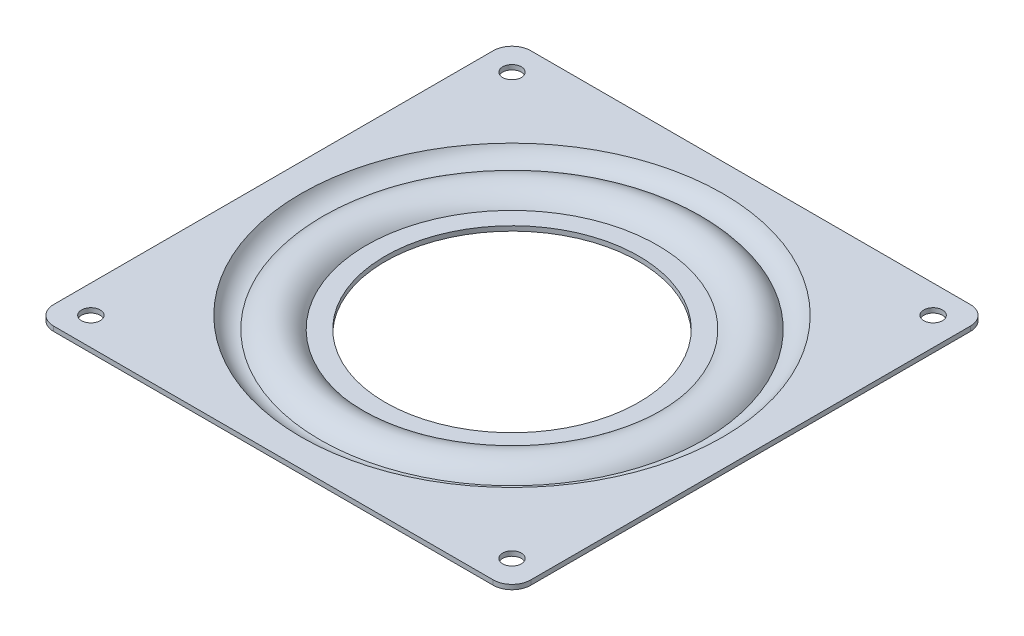
ISO-10303-21;
HEADER;
FILE_DESCRIPTION(('STEP AP214'),'2;1');
FILE_NAME('part.step','',(''),(''),'','','');
FILE_SCHEMA(('AUTOMOTIVE_DESIGN { 1 0 10303 214 1 1 1 1 }'));
ENDSEC;
DATA;
#1=APPLICATION_CONTEXT('core data for automotive mechanical design processes');
#2=APPLICATION_PROTOCOL_DEFINITION('international standard','automotive_design',2000,#1);
#3=PRODUCT_CONTEXT('',#1,'mechanical');
#4=PRODUCT('Part','Part','',(#3));
#5=PRODUCT_RELATED_PRODUCT_CATEGORY('part','',(#4));
#6=PRODUCT_DEFINITION_FORMATION('','',#4);
#7=PRODUCT_DEFINITION_CONTEXT('part definition',#1,'design');
#8=PRODUCT_DEFINITION('design','',#6,#7);
#9=PRODUCT_DEFINITION_SHAPE('','',#8);
#10=(LENGTH_UNIT() NAMED_UNIT(*) SI_UNIT(.MILLI.,.METRE.));
#11=(NAMED_UNIT(*) PLANE_ANGLE_UNIT() SI_UNIT($,.RADIAN.));
#12=(NAMED_UNIT(*) SI_UNIT($,.STERADIAN.) SOLID_ANGLE_UNIT());
#13=UNCERTAINTY_MEASURE_WITH_UNIT(LENGTH_MEASURE(1.E-05),#10,'distance_accuracy_value','');
#14=(GEOMETRIC_REPRESENTATION_CONTEXT(3) GLOBAL_UNCERTAINTY_ASSIGNED_CONTEXT((#13)) GLOBAL_UNIT_ASSIGNED_CONTEXT((#10,
#11,#12)) REPRESENTATION_CONTEXT('',''));
#15=CARTESIAN_POINT('',(0.,0.,0.));
#16=DIRECTION('',(0.,0.,1.));
#17=DIRECTION('',(1.,0.,0.));
#18=AXIS2_PLACEMENT_3D('',#15,#16,#17);
#19=CARTESIAN_POINT('',(0.,1.93021402871017,0.));
#20=DIRECTION('',(0.,1.,0.));
#21=DIRECTION('',(0.,0.,1.));
#22=AXIS2_PLACEMENT_3D('',#19,#20,#21);
#23=TOROIDAL_SURFACE('',#22,40.8455333460894,5.5);
#24=CARTESIAN_POINT('',(0.,-3.5402036630778,0.));
#25=DIRECTION('',(0.,1.,0.));
#26=DIRECTION('',(0.,0.,1.));
#27=AXIS2_PLACEMENT_3D('',#24,#25,#26);
#28=CIRCLE('',#27,40.2758577565007);
#29=CARTESIAN_POINT('',(0.,-3.5402036630778,40.2758577565007));
#30=VERTEX_POINT('',#29);
#31=EDGE_CURVE('E11',#30,#30,#28,.T.);
#32=ORIENTED_EDGE('',*,*,#31,.T.);
#33=EDGE_LOOP('',(#32));
#34=FACE_BOUND('',#33,.T.);
#35=CARTESIAN_POINT('',(0.,-1.,0.));
#36=DIRECTION('',(0.,1.,0.));
#37=DIRECTION('',(0.,0.,1.));
#38=AXIS2_PLACEMENT_3D('',#35,#36,#37);
#39=CIRCLE('',#38,45.4999770019897);
#40=CARTESIAN_POINT('',(0.,-1.,45.4999770019897));
#41=VERTEX_POINT('',#40);
#42=EDGE_CURVE('E46',#41,#41,#39,.F.);
#43=ORIENTED_EDGE('',*,*,#42,.T.);
#44=EDGE_LOOP('',(#43));
#45=FACE_BOUND('',#44,.T.);
#46=ADVANCED_FACE('F43',(#34,#45),#23,.T.);
#47=CARTESIAN_POINT('',(0.,-6.,0.));
#48=DIRECTION('',(0.,1.,0.));
#49=DIRECTION('',(0.,0.,1.));
#50=AXIS2_PLACEMENT_3D('',#47,#48,#49);
#51=TOROIDAL_SURFACE('',#50,35.9227666730447,5.);
#52=CARTESIAN_POINT('',(0.,-3.56978597128984,0.));
#53=DIRECTION('',(0.,1.,0.));
#54=DIRECTION('',(0.,0.,1.));
#55=AXIS2_PLACEMENT_3D('',#52,#53,#54);
#56=CIRCLE('',#55,31.5530916537029);
#57=CARTESIAN_POINT('',(0.,-3.56978597128984,31.5530916537029));
#58=VERTEX_POINT('',#57);
#59=EDGE_CURVE('E52',#58,#58,#56,.T.);
#60=ORIENTED_EDGE('',*,*,#59,.T.);
#61=EDGE_LOOP('',(#60));
#62=FACE_BOUND('',#61,.T.);
#63=ORIENTED_EDGE('',*,*,#31,.F.);
#64=EDGE_LOOP('',(#63));
#65=FACE_BOUND('',#64,.T.);
#66=ADVANCED_FACE('F204',(#62,#65),#51,.F.);
#67=CARTESIAN_POINT('',(0.,-3.56978597128984,0.));
#68=DIRECTION('',(0.,-1.,0.));
#69=DIRECTION('',(0.,0.,-1.));
#70=AXIS2_PLACEMENT_3D('',#67,#68,#69);
#71=PLANE('',#70);
#72=CARTESIAN_POINT('',(0.,-3.56978597128984,0.));
#73=DIRECTION('',(0.,1.,0.));
#74=DIRECTION('',(0.,0.,1.));
#75=AXIS2_PLACEMENT_3D('',#72,#73,#74);
#76=CIRCLE('',#75,27.);
#77=CARTESIAN_POINT('',(0.,-3.56978597128984,27.));
#78=VERTEX_POINT('',#77);
#79=EDGE_CURVE('E198',#78,#78,#76,.T.);
#80=ORIENTED_EDGE('',*,*,#79,.T.);
#81=EDGE_LOOP('',(#80));
#82=FACE_BOUND('',#81,.T.);
#83=ORIENTED_EDGE('',*,*,#59,.F.);
#84=EDGE_LOOP('',(#83));
#85=FACE_BOUND('',#84,.T.);
#86=ADVANCED_FACE('F207',(#82,#85),#71,.T.);
#87=CARTESIAN_POINT('',(0.,6.91716042477171,0.));
#88=DIRECTION('',(0.,1.,0.));
#89=DIRECTION('',(0.,0.,1.));
#90=AXIS2_PLACEMENT_3D('',#87,#88,#89);
#91=CYLINDRICAL_SURFACE('',#90,27.);
#92=ORIENTED_EDGE('',*,*,#79,.F.);
#93=EDGE_LOOP('',(#92));
#94=FACE_BOUND('',#93,.T.);
#95=CARTESIAN_POINT('',(0.,-2.56978597128984,0.));
#96=DIRECTION('',(0.,1.,0.));
#97=DIRECTION('',(0.,0.,1.));
#98=AXIS2_PLACEMENT_3D('',#95,#96,#97);
#99=CIRCLE('',#98,27.);
#100=CARTESIAN_POINT('',(0.,-2.56978597128984,27.));
#101=VERTEX_POINT('',#100);
#102=EDGE_CURVE('E195',#101,#101,#99,.T.);
#103=ORIENTED_EDGE('',*,*,#102,.T.);
#104=EDGE_LOOP('',(#103));
#105=FACE_BOUND('',#104,.T.);
#106=ADVANCED_FACE('F209',(#94,#105),#91,.F.);
#107=CARTESIAN_POINT('',(0.,-2.56978597128984,0.));
#108=DIRECTION('',(0.,-1.,0.));
#109=DIRECTION('',(0.,0.,-1.));
#110=AXIS2_PLACEMENT_3D('',#107,#108,#109);
#111=PLANE('',#110);
#112=ORIENTED_EDGE('',*,*,#102,.F.);
#113=EDGE_LOOP('',(#112));
#114=FACE_BOUND('',#113,.T.);
#115=CARTESIAN_POINT('',(0.,-2.56978597128984,0.));
#116=DIRECTION('',(0.,1.,0.));
#117=DIRECTION('',(0.,0.,1.));
#118=AXIS2_PLACEMENT_3D('',#115,#116,#117);
#119=CIRCLE('',#118,31.);
#120=CARTESIAN_POINT('',(0.,-2.56978597128984,31.));
#121=VERTEX_POINT('',#120);
#122=EDGE_CURVE('E192',#121,#121,#119,.T.);
#123=ORIENTED_EDGE('',*,*,#122,.T.);
#124=EDGE_LOOP('',(#123));
#125=FACE_BOUND('',#124,.T.);
#126=ADVANCED_FACE('F216',(#114,#125),#111,.F.);
#127=CARTESIAN_POINT('',(0.,-6.,0.));
#128=DIRECTION('',(0.,1.,0.));
#129=DIRECTION('',(0.,0.,1.));
#130=AXIS2_PLACEMENT_3D('',#127,#128,#129);
#131=TOROIDAL_SURFACE('',#130,35.9227666730447,6.);
#132=ORIENTED_EDGE('',*,*,#122,.F.);
#133=EDGE_LOOP('',(#132));
#134=FACE_BOUND('',#133,.T.);
#135=CARTESIAN_POINT('',(0.,-2.56978597128983,0.));
#136=DIRECTION('',(0.,1.,0.));
#137=DIRECTION('',(0.,0.,1.));
#138=AXIS2_PLACEMENT_3D('',#135,#136,#137);
#139=CIRCLE('',#138,40.8455333460895);
#140=CARTESIAN_POINT('',(0.,-2.56978597128983,40.8455333460895));
#141=VERTEX_POINT('',#140);
#142=EDGE_CURVE('E189',#141,#141,#139,.T.);
#143=ORIENTED_EDGE('',*,*,#142,.T.);
#144=EDGE_LOOP('',(#143));
#145=FACE_BOUND('',#144,.T.);
#146=ADVANCED_FACE('F311',(#134,#145),#131,.T.);
#147=CARTESIAN_POINT('',(0.,1.93021402871017,0.));
#148=DIRECTION('',(0.,1.,0.));
#149=DIRECTION('',(0.,0.,1.));
#150=AXIS2_PLACEMENT_3D('',#147,#148,#149);
#151=TOROIDAL_SURFACE('',#150,40.8455333460894,4.5);
#152=ORIENTED_EDGE('',*,*,#142,.F.);
#153=EDGE_LOOP('',(#152));
#154=FACE_BOUND('',#153,.T.);
#155=CARTESIAN_POINT('',(0.,0.,0.));
#156=DIRECTION('',(0.,1.,0.));
#157=DIRECTION('',(0.,0.,1.));
#158=AXIS2_PLACEMENT_3D('',#155,#156,#157);
#159=CIRCLE('',#158,44.9105393489596);
#160=CARTESIAN_POINT('',(0.,0.,44.9105393489596));
#161=VERTEX_POINT('',#160);
#162=EDGE_CURVE('E142',#161,#161,#159,.T.);
#163=ORIENTED_EDGE('',*,*,#162,.T.);
#164=EDGE_LOOP('',(#163));
#165=FACE_BOUND('',#164,.T.);
#166=ADVANCED_FACE('F279',(#154,#165),#151,.F.);
#167=CARTESIAN_POINT('',(-50.8,-1.,0.));
#168=DIRECTION('',(-1.,0.,0.));
#169=DIRECTION('',(0.,0.,1.));
#170=AXIS2_PLACEMENT_3D('',#167,#168,#169);
#171=PLANE('',#170);
#172=DIRECTION('',(0.,0.,1.));
#173=VECTOR('',#172,1.);
#174=CARTESIAN_POINT('',(-50.8,0.,0.));
#175=LINE('',#174,#173);
#176=CARTESIAN_POINT('',(-50.8,0.,-46.8000000000002));
#177=VERTEX_POINT('',#176);
#178=CARTESIAN_POINT('',(-50.8,0.,46.7999999999998));
#179=VERTEX_POINT('',#178);
#180=EDGE_CURVE('E157',#177,#179,#175,.T.);
#181=ORIENTED_EDGE('',*,*,#180,.F.);
#182=DIRECTION('',(0.,1.,0.));
#183=VECTOR('',#182,1.);
#184=CARTESIAN_POINT('',(-50.8,-1.,-46.8000000000002));
#185=LINE('',#184,#183);
#186=CARTESIAN_POINT('',(-50.8,-1.,-46.8000000000002));
#187=VERTEX_POINT('',#186);
#188=EDGE_CURVE('E60',#187,#177,#185,.T.);
#189=ORIENTED_EDGE('',*,*,#188,.F.);
#190=DIRECTION('',(0.,0.,1.));
#191=VECTOR('',#190,1.);
#192=CARTESIAN_POINT('',(-50.8,-1.,0.));
#193=LINE('',#192,#191);
#194=CARTESIAN_POINT('',(-50.8,-1.,46.7999999999998));
#195=VERTEX_POINT('',#194);
#196=EDGE_CURVE('E250',#187,#195,#193,.T.);
#197=ORIENTED_EDGE('',*,*,#196,.T.);
#198=DIRECTION('',(0.,1.,0.));
#199=VECTOR('',#198,1.);
#200=CARTESIAN_POINT('',(-50.8,-1.,46.7999999999998));
#201=LINE('',#200,#199);
#202=EDGE_CURVE('E101',#195,#179,#201,.T.);
#203=ORIENTED_EDGE('',*,*,#202,.T.);
#204=EDGE_LOOP('',(#181,#189,#197,#203));
#205=FACE_BOUND('',#204,.T.);
#206=ADVANCED_FACE('F270',(#205),#171,.T.);
#207=CARTESIAN_POINT('',(-46.8,-1.,-46.8000000000002));
#208=DIRECTION('',(0.,1.,0.));
#209=DIRECTION('',(0.,0.,1.));
#210=AXIS2_PLACEMENT_3D('',#207,#208,#209);
#211=CYLINDRICAL_SURFACE('',#210,4.00000000000001);
#212=CARTESIAN_POINT('',(-46.8,0.,-46.8000000000002));
#213=DIRECTION('',(0.,1.,0.));
#214=DIRECTION('',(0.,0.,1.));
#215=AXIS2_PLACEMENT_3D('',#212,#213,#214);
#216=CIRCLE('',#215,4.00000000000001);
#217=CARTESIAN_POINT('',(-46.8,0.,-50.8000000000002));
#218=VERTEX_POINT('',#217);
#219=EDGE_CURVE('E175',#218,#177,#216,.T.);
#220=ORIENTED_EDGE('',*,*,#219,.F.);
#221=DIRECTION('',(0.,1.,0.));
#222=VECTOR('',#221,1.);
#223=CARTESIAN_POINT('',(-46.8,-1.,-50.8000000000002));
#224=LINE('',#223,#222);
#225=CARTESIAN_POINT('',(-46.8,-1.,-50.8000000000002));
#226=VERTEX_POINT('',#225);
#227=EDGE_CURVE('E89',#226,#218,#224,.T.);
#228=ORIENTED_EDGE('',*,*,#227,.F.);
#229=CARTESIAN_POINT('',(-46.8,-1.,-46.8000000000002));
#230=DIRECTION('',(0.,1.,0.));
#231=DIRECTION('',(0.,0.,1.));
#232=AXIS2_PLACEMENT_3D('',#229,#230,#231);
#233=CIRCLE('',#232,4.00000000000001);
#234=EDGE_CURVE('E123',#226,#187,#233,.T.);
#235=ORIENTED_EDGE('',*,*,#234,.T.);
#236=ORIENTED_EDGE('',*,*,#188,.T.);
#237=EDGE_LOOP('',(#220,#228,#235,#236));
#238=FACE_BOUND('',#237,.T.);
#239=ADVANCED_FACE('F272',(#238),#211,.T.);
#240=CARTESIAN_POINT('',(0.,-1.,-50.8000000000002));
#241=DIRECTION('',(0.,0.,1.));
#242=DIRECTION('',(1.,0.,0.));
#243=AXIS2_PLACEMENT_3D('',#240,#241,#242);
#244=PLANE('',#243);
#245=DIRECTION('',(1.,0.,0.));
#246=VECTOR('',#245,1.);
#247=CARTESIAN_POINT('',(0.,0.,-50.8000000000002));
#248=LINE('',#247,#246);
#249=CARTESIAN_POINT('',(46.8,0.,-50.8000000000002));
#250=VERTEX_POINT('',#249);
#251=EDGE_CURVE('E127',#218,#250,#248,.T.);
#252=ORIENTED_EDGE('',*,*,#251,.T.);
#253=DIRECTION('',(0.,1.,0.));
#254=VECTOR('',#253,1.);
#255=CARTESIAN_POINT('',(46.8,-1.,-50.8000000000002));
#256=LINE('',#255,#254);
#257=CARTESIAN_POINT('',(46.8,-1.,-50.8000000000002));
#258=VERTEX_POINT('',#257);
#259=EDGE_CURVE('E125',#258,#250,#256,.T.);
#260=ORIENTED_EDGE('',*,*,#259,.F.);
#261=DIRECTION('',(1.,0.,0.));
#262=VECTOR('',#261,1.);
#263=CARTESIAN_POINT('',(0.,-1.,-50.8000000000002));
#264=LINE('',#263,#262);
#265=EDGE_CURVE('E118',#226,#258,#264,.T.);
#266=ORIENTED_EDGE('',*,*,#265,.F.);
#267=ORIENTED_EDGE('',*,*,#227,.T.);
#268=EDGE_LOOP('',(#252,#260,#266,#267));
#269=FACE_BOUND('',#268,.T.);
#270=ADVANCED_FACE('F126',(#269),#244,.F.);
#271=CARTESIAN_POINT('',(46.8,-1.,-46.8000000000002));
#272=DIRECTION('',(0.,1.,0.));
#273=DIRECTION('',(0.,0.,1.));
#274=AXIS2_PLACEMENT_3D('',#271,#272,#273);
#275=CYLINDRICAL_SURFACE('',#274,4.);
#276=CARTESIAN_POINT('',(46.8,0.,-46.8000000000002));
#277=DIRECTION('',(0.,1.,0.));
#278=DIRECTION('',(0.,0.,1.));
#279=AXIS2_PLACEMENT_3D('',#276,#277,#278);
#280=CIRCLE('',#279,4.);
#281=CARTESIAN_POINT('',(50.8,0.,-46.8000000000002));
#282=VERTEX_POINT('',#281);
#283=EDGE_CURVE('E172',#282,#250,#280,.T.);
#284=ORIENTED_EDGE('',*,*,#283,.F.);
#285=DIRECTION('',(0.,1.,0.));
#286=VECTOR('',#285,1.);
#287=CARTESIAN_POINT('',(50.8,-1.,-46.8000000000002));
#288=LINE('',#287,#286);
#289=CARTESIAN_POINT('',(50.8,-1.,-46.8000000000002));
#290=VERTEX_POINT('',#289);
#291=EDGE_CURVE('E131',#290,#282,#288,.T.);
#292=ORIENTED_EDGE('',*,*,#291,.F.);
#293=CARTESIAN_POINT('',(46.8,-1.,-46.8000000000002));
#294=DIRECTION('',(0.,1.,0.));
#295=DIRECTION('',(0.,0.,1.));
#296=AXIS2_PLACEMENT_3D('',#293,#294,#295);
#297=CIRCLE('',#296,4.);
#298=EDGE_CURVE('E122',#290,#258,#297,.T.);
#299=ORIENTED_EDGE('',*,*,#298,.T.);
#300=ORIENTED_EDGE('',*,*,#259,.T.);
#301=EDGE_LOOP('',(#284,#292,#299,#300));
#302=FACE_BOUND('',#301,.T.);
#303=ADVANCED_FACE('F133',(#302),#275,.T.);
#304=CARTESIAN_POINT('',(50.8,-1.,0.));
#305=DIRECTION('',(-1.,0.,0.));
#306=DIRECTION('',(0.,0.,1.));
#307=AXIS2_PLACEMENT_3D('',#304,#305,#306);
#308=PLANE('',#307);
#309=DIRECTION('',(0.,0.,1.));
#310=VECTOR('',#309,1.);
#311=CARTESIAN_POINT('',(50.8,0.,0.));
#312=LINE('',#311,#310);
#313=CARTESIAN_POINT('',(50.8,0.,46.7999999999998));
#314=VERTEX_POINT('',#313);
#315=EDGE_CURVE('E169',#282,#314,#312,.T.);
#316=ORIENTED_EDGE('',*,*,#315,.T.);
#317=DIRECTION('',(0.,1.,0.));
#318=VECTOR('',#317,1.);
#319=CARTESIAN_POINT('',(50.8,-1.,46.7999999999998));
#320=LINE('',#319,#318);
#321=CARTESIAN_POINT('',(50.8,-1.,46.7999999999998));
#322=VERTEX_POINT('',#321);
#323=EDGE_CURVE('E182',#322,#314,#320,.T.);
#324=ORIENTED_EDGE('',*,*,#323,.F.);
#325=DIRECTION('',(0.,0.,1.));
#326=VECTOR('',#325,1.);
#327=CARTESIAN_POINT('',(50.8,-1.,0.));
#328=LINE('',#327,#326);
#329=EDGE_CURVE('E135',#290,#322,#328,.T.);
#330=ORIENTED_EDGE('',*,*,#329,.F.);
#331=ORIENTED_EDGE('',*,*,#291,.T.);
#332=EDGE_LOOP('',(#316,#324,#330,#331));
#333=FACE_BOUND('',#332,.T.);
#334=ADVANCED_FACE('F285',(#333),#308,.F.);
#335=CARTESIAN_POINT('',(46.8,-1.,46.7999999999998));
#336=DIRECTION('',(0.,1.,0.));
#337=DIRECTION('',(0.,0.,1.));
#338=AXIS2_PLACEMENT_3D('',#335,#336,#337);
#339=CYLINDRICAL_SURFACE('',#338,4.00000000000001);
#340=CARTESIAN_POINT('',(46.8,0.,46.7999999999998));
#341=DIRECTION('',(0.,1.,0.));
#342=DIRECTION('',(0.,0.,1.));
#343=AXIS2_PLACEMENT_3D('',#340,#341,#342);
#344=CIRCLE('',#343,4.00000000000001);
#345=CARTESIAN_POINT('',(46.8,0.,50.7999999999998));
#346=VERTEX_POINT('',#345);
#347=EDGE_CURVE('E166',#346,#314,#344,.T.);
#348=ORIENTED_EDGE('',*,*,#347,.F.);
#349=DIRECTION('',(0.,1.,0.));
#350=VECTOR('',#349,1.);
#351=CARTESIAN_POINT('',(46.8,-1.,50.7999999999998));
#352=LINE('',#351,#350);
#353=CARTESIAN_POINT('',(46.8,-1.,50.7999999999998));
#354=VERTEX_POINT('',#353);
#355=EDGE_CURVE('E184',#354,#346,#352,.T.);
#356=ORIENTED_EDGE('',*,*,#355,.F.);
#357=CARTESIAN_POINT('',(46.8,-1.,46.7999999999998));
#358=DIRECTION('',(0.,1.,0.));
#359=DIRECTION('',(0.,0.,1.));
#360=AXIS2_PLACEMENT_3D('',#357,#358,#359);
#361=CIRCLE('',#360,4.00000000000001);
#362=EDGE_CURVE('E137',#354,#322,#361,.T.);
#363=ORIENTED_EDGE('',*,*,#362,.T.);
#364=ORIENTED_EDGE('',*,*,#323,.T.);
#365=EDGE_LOOP('',(#348,#356,#363,#364));
#366=FACE_BOUND('',#365,.T.);
#367=ADVANCED_FACE('F264',(#366),#339,.T.);
#368=CARTESIAN_POINT('',(0.,-1.,50.7999999999998));
#369=DIRECTION('',(0.,0.,1.));
#370=DIRECTION('',(1.,0.,0.));
#371=AXIS2_PLACEMENT_3D('',#368,#369,#370);
#372=PLANE('',#371);
#373=DIRECTION('',(1.,0.,0.));
#374=VECTOR('',#373,1.);
#375=CARTESIAN_POINT('',(0.,0.,50.7999999999998));
#376=LINE('',#375,#374);
#377=CARTESIAN_POINT('',(-46.8,0.,50.7999999999998));
#378=VERTEX_POINT('',#377);
#379=EDGE_CURVE('E163',#378,#346,#376,.T.);
#380=ORIENTED_EDGE('',*,*,#379,.F.);
#381=DIRECTION('',(0.,1.,0.));
#382=VECTOR('',#381,1.);
#383=CARTESIAN_POINT('',(-46.8,-1.,50.7999999999998));
#384=LINE('',#383,#382);
#385=CARTESIAN_POINT('',(-46.8,-1.,50.7999999999998));
#386=VERTEX_POINT('',#385);
#387=EDGE_CURVE('E186',#386,#378,#384,.T.);
#388=ORIENTED_EDGE('',*,*,#387,.F.);
#389=DIRECTION('',(1.,0.,0.));
#390=VECTOR('',#389,1.);
#391=CARTESIAN_POINT('',(0.,-1.,50.7999999999998));
#392=LINE('',#391,#390);
#393=EDGE_CURVE('E258',#386,#354,#392,.T.);
#394=ORIENTED_EDGE('',*,*,#393,.T.);
#395=ORIENTED_EDGE('',*,*,#355,.T.);
#396=EDGE_LOOP('',(#380,#388,#394,#395));
#397=FACE_BOUND('',#396,.T.);
#398=ADVANCED_FACE('F269',(#397),#372,.T.);
#399=CARTESIAN_POINT('',(-44.8449999999848,-1.,44.8449999999846));
#400=DIRECTION('',(0.,1.,0.));
#401=DIRECTION('',(0.,0.,1.));
#402=AXIS2_PLACEMENT_3D('',#399,#400,#401);
#403=CYLINDRICAL_SURFACE('',#402,1.985);
#404=CARTESIAN_POINT('',(-44.8449999999848,-1.,44.8449999999846));
#405=DIRECTION('',(0.,1.,0.));
#406=DIRECTION('',(0.,0.,1.));
#407=AXIS2_PLACEMENT_3D('',#404,#405,#406);
#408=CIRCLE('',#407,1.985);
#409=CARTESIAN_POINT('',(-44.8449999999848,-1.,46.8299999999846));
#410=VERTEX_POINT('',#409);
#411=EDGE_CURVE('E248',#410,#410,#408,.T.);
#412=ORIENTED_EDGE('',*,*,#411,.F.);
#413=EDGE_LOOP('',(#412));
#414=FACE_BOUND('',#413,.T.);
#415=CARTESIAN_POINT('',(-44.8449999999848,0.,44.8449999999846));
#416=DIRECTION('',(0.,1.,0.));
#417=DIRECTION('',(0.,0.,1.));
#418=AXIS2_PLACEMENT_3D('',#415,#416,#417);
#419=CIRCLE('',#418,1.985);
#420=CARTESIAN_POINT('',(-44.8449999999848,0.,46.8299999999846));
#421=VERTEX_POINT('',#420);
#422=EDGE_CURVE('E154',#421,#421,#419,.T.);
#423=ORIENTED_EDGE('',*,*,#422,.T.);
#424=EDGE_LOOP('',(#423));
#425=FACE_BOUND('',#424,.T.);
#426=ADVANCED_FACE('F293',(#414,#425),#403,.F.);
#427=CARTESIAN_POINT('',(44.8449999999848,-1.,44.8449999999846));
#428=DIRECTION('',(0.,1.,0.));
#429=DIRECTION('',(0.,0.,1.));
#430=AXIS2_PLACEMENT_3D('',#427,#428,#429);
#431=CYLINDRICAL_SURFACE('',#430,1.985);
#432=CARTESIAN_POINT('',(44.8449999999848,-1.,44.8449999999846));
#433=DIRECTION('',(0.,1.,0.));
#434=DIRECTION('',(0.,0.,1.));
#435=AXIS2_PLACEMENT_3D('',#432,#433,#434);
#436=CIRCLE('',#435,1.985);
#437=CARTESIAN_POINT('',(44.8449999999848,-1.,46.8299999999846));
#438=VERTEX_POINT('',#437);
#439=EDGE_CURVE('E245',#438,#438,#436,.T.);
#440=ORIENTED_EDGE('',*,*,#439,.F.);
#441=EDGE_LOOP('',(#440));
#442=FACE_BOUND('',#441,.T.);
#443=CARTESIAN_POINT('',(44.8449999999848,0.,44.8449999999846));
#444=DIRECTION('',(0.,1.,0.));
#445=DIRECTION('',(0.,0.,1.));
#446=AXIS2_PLACEMENT_3D('',#443,#444,#445);
#447=CIRCLE('',#446,1.985);
#448=CARTESIAN_POINT('',(44.8449999999848,0.,46.8299999999846));
#449=VERTEX_POINT('',#448);
#450=EDGE_CURVE('E151',#449,#449,#447,.T.);
#451=ORIENTED_EDGE('',*,*,#450,.T.);
#452=EDGE_LOOP('',(#451));
#453=FACE_BOUND('',#452,.T.);
#454=ADVANCED_FACE('F299',(#442,#453),#431,.F.);
#455=CARTESIAN_POINT('',(44.8449999999847,-1.,-44.8449999999849));
#456=DIRECTION('',(0.,1.,0.));
#457=DIRECTION('',(0.,0.,1.));
#458=AXIS2_PLACEMENT_3D('',#455,#456,#457);
#459=CYLINDRICAL_SURFACE('',#458,1.985);
#460=CARTESIAN_POINT('',(44.8449999999847,-1.,-44.8449999999849));
#461=DIRECTION('',(0.,1.,0.));
#462=DIRECTION('',(0.,0.,1.));
#463=AXIS2_PLACEMENT_3D('',#460,#461,#462);
#464=CIRCLE('',#463,1.985);
#465=CARTESIAN_POINT('',(44.8449999999847,-1.,-42.8599999999849));
#466=VERTEX_POINT('',#465);
#467=EDGE_CURVE('E241',#466,#466,#464,.T.);
#468=ORIENTED_EDGE('',*,*,#467,.F.);
#469=EDGE_LOOP('',(#468));
#470=FACE_BOUND('',#469,.T.);
#471=CARTESIAN_POINT('',(44.8449999999847,0.,-44.8449999999849));
#472=DIRECTION('',(0.,1.,0.));
#473=DIRECTION('',(0.,0.,1.));
#474=AXIS2_PLACEMENT_3D('',#471,#472,#473);
#475=CIRCLE('',#474,1.985);
#476=CARTESIAN_POINT('',(44.8449999999847,0.,-42.8599999999849));
#477=VERTEX_POINT('',#476);
#478=EDGE_CURVE('E148',#477,#477,#475,.T.);
#479=ORIENTED_EDGE('',*,*,#478,.T.);
#480=EDGE_LOOP('',(#479));
#481=FACE_BOUND('',#480,.T.);
#482=ADVANCED_FACE('F302',(#470,#481),#459,.F.);
#483=CARTESIAN_POINT('',(-44.8449999999848,-1.,-44.8449999999849));
#484=DIRECTION('',(0.,1.,0.));
#485=DIRECTION('',(0.,0.,1.));
#486=AXIS2_PLACEMENT_3D('',#483,#484,#485);
#487=CYLINDRICAL_SURFACE('',#486,1.985);
#488=CARTESIAN_POINT('',(-44.8449999999848,-1.,-44.8449999999849));
#489=DIRECTION('',(0.,1.,0.));
#490=DIRECTION('',(0.,0.,1.));
#491=AXIS2_PLACEMENT_3D('',#488,#489,#490);
#492=CIRCLE('',#491,1.985);
#493=CARTESIAN_POINT('',(-44.8449999999848,-1.,-42.8599999999849));
#494=VERTEX_POINT('',#493);
#495=EDGE_CURVE('E178',#494,#494,#492,.T.);
#496=ORIENTED_EDGE('',*,*,#495,.F.);
#497=EDGE_LOOP('',(#496));
#498=FACE_BOUND('',#497,.T.);
#499=CARTESIAN_POINT('',(-44.8449999999848,0.,-44.8449999999849));
#500=DIRECTION('',(0.,1.,0.));
#501=DIRECTION('',(0.,0.,1.));
#502=AXIS2_PLACEMENT_3D('',#499,#500,#501);
#503=CIRCLE('',#502,1.985);
#504=CARTESIAN_POINT('',(-44.8449999999848,0.,-42.8599999999849));
#505=VERTEX_POINT('',#504);
#506=EDGE_CURVE('E145',#505,#505,#503,.T.);
#507=ORIENTED_EDGE('',*,*,#506,.T.);
#508=EDGE_LOOP('',(#507));
#509=FACE_BOUND('',#508,.T.);
#510=ADVANCED_FACE('F295',(#498,#509),#487,.F.);
#511=CARTESIAN_POINT('',(-46.8,-1.,46.7999999999998));
#512=DIRECTION('',(0.,1.,0.));
#513=DIRECTION('',(0.,0.,1.));
#514=AXIS2_PLACEMENT_3D('',#511,#512,#513);
#515=CYLINDRICAL_SURFACE('',#514,4.);
#516=CARTESIAN_POINT('',(-46.8,0.,46.7999999999998));
#517=DIRECTION('',(0.,1.,0.));
#518=DIRECTION('',(0.,0.,1.));
#519=AXIS2_PLACEMENT_3D('',#516,#517,#518);
#520=CIRCLE('',#519,4.);
#521=EDGE_CURVE('E160',#179,#378,#520,.T.);
#522=ORIENTED_EDGE('',*,*,#521,.F.);
#523=ORIENTED_EDGE('',*,*,#202,.F.);
#524=CARTESIAN_POINT('',(-46.8,-1.,46.7999999999998));
#525=DIRECTION('',(0.,1.,0.));
#526=DIRECTION('',(0.,0.,1.));
#527=AXIS2_PLACEMENT_3D('',#524,#525,#526);
#528=CIRCLE('',#527,4.);
#529=EDGE_CURVE('E252',#195,#386,#528,.T.);
#530=ORIENTED_EDGE('',*,*,#529,.T.);
#531=ORIENTED_EDGE('',*,*,#387,.T.);
#532=EDGE_LOOP('',(#522,#523,#530,#531));
#533=FACE_BOUND('',#532,.T.);
#534=ADVANCED_FACE('F233',(#533),#515,.T.);
#535=CARTESIAN_POINT('',(0.,-1.,0.));
#536=DIRECTION('',(0.,1.,0.));
#537=DIRECTION('',(0.,0.,1.));
#538=AXIS2_PLACEMENT_3D('',#535,#536,#537);
#539=PLANE('',#538);
#540=ORIENTED_EDGE('',*,*,#42,.F.);
#541=EDGE_LOOP('',(#540));
#542=FACE_BOUND('',#541,.T.);
#543=ORIENTED_EDGE('',*,*,#495,.T.);
#544=EDGE_LOOP('',(#543));
#545=FACE_BOUND('',#544,.T.);
#546=ORIENTED_EDGE('',*,*,#467,.T.);
#547=EDGE_LOOP('',(#546));
#548=FACE_BOUND('',#547,.T.);
#549=ORIENTED_EDGE('',*,*,#439,.T.);
#550=EDGE_LOOP('',(#549));
#551=FACE_BOUND('',#550,.T.);
#552=ORIENTED_EDGE('',*,*,#411,.T.);
#553=EDGE_LOOP('',(#552));
#554=FACE_BOUND('',#553,.T.);
#555=ORIENTED_EDGE('',*,*,#196,.F.);
#556=ORIENTED_EDGE('',*,*,#234,.F.);
#557=ORIENTED_EDGE('',*,*,#265,.T.);
#558=ORIENTED_EDGE('',*,*,#298,.F.);
#559=ORIENTED_EDGE('',*,*,#329,.T.);
#560=ORIENTED_EDGE('',*,*,#362,.F.);
#561=ORIENTED_EDGE('',*,*,#393,.F.);
#562=ORIENTED_EDGE('',*,*,#529,.F.);
#563=EDGE_LOOP('',(#555,#556,#557,#558,#559,#560,#561,#562));
#564=FACE_BOUND('',#563,.T.);
#565=ADVANCED_FACE('F120',(#542,#545,#548,#551,#554,#564),#539,.F.);
#566=CARTESIAN_POINT('',(0.,0.,0.));
#567=DIRECTION('',(0.,1.,0.));
#568=DIRECTION('',(0.,0.,1.));
#569=AXIS2_PLACEMENT_3D('',#566,#567,#568);
#570=PLANE('',#569);
#571=ORIENTED_EDGE('',*,*,#162,.F.);
#572=EDGE_LOOP('',(#571));
#573=FACE_BOUND('',#572,.T.);
#574=ORIENTED_EDGE('',*,*,#506,.F.);
#575=EDGE_LOOP('',(#574));
#576=FACE_BOUND('',#575,.T.);
#577=ORIENTED_EDGE('',*,*,#478,.F.);
#578=EDGE_LOOP('',(#577));
#579=FACE_BOUND('',#578,.T.);
#580=ORIENTED_EDGE('',*,*,#450,.F.);
#581=EDGE_LOOP('',(#580));
#582=FACE_BOUND('',#581,.T.);
#583=ORIENTED_EDGE('',*,*,#422,.F.);
#584=EDGE_LOOP('',(#583));
#585=FACE_BOUND('',#584,.T.);
#586=ORIENTED_EDGE('',*,*,#180,.T.);
#587=ORIENTED_EDGE('',*,*,#521,.T.);
#588=ORIENTED_EDGE('',*,*,#379,.T.);
#589=ORIENTED_EDGE('',*,*,#347,.T.);
#590=ORIENTED_EDGE('',*,*,#315,.F.);
#591=ORIENTED_EDGE('',*,*,#283,.T.);
#592=ORIENTED_EDGE('',*,*,#251,.F.);
#593=ORIENTED_EDGE('',*,*,#219,.T.);
#594=EDGE_LOOP('',(#586,#587,#588,#589,#590,#591,#592,#593));
#595=FACE_BOUND('',#594,.T.);
#596=ADVANCED_FACE('F232',(#573,#576,#579,#582,#585,#595),#570,.T.);
#597=CLOSED_SHELL('',(#46,#66,#86,#106,#126,#146,#166,#206,#239,#270,#303,#334,#367,#398,#426,
#454,#482,#510,#534,#565,#596));
#598=MANIFOLD_SOLID_BREP('B2',#597);
#599=ADVANCED_BREP_SHAPE_REPRESENTATION('',(#18,#598),#14);
#600=SHAPE_DEFINITION_REPRESENTATION(#9,#599);
ENDSEC;
END-ISO-10303-21;
